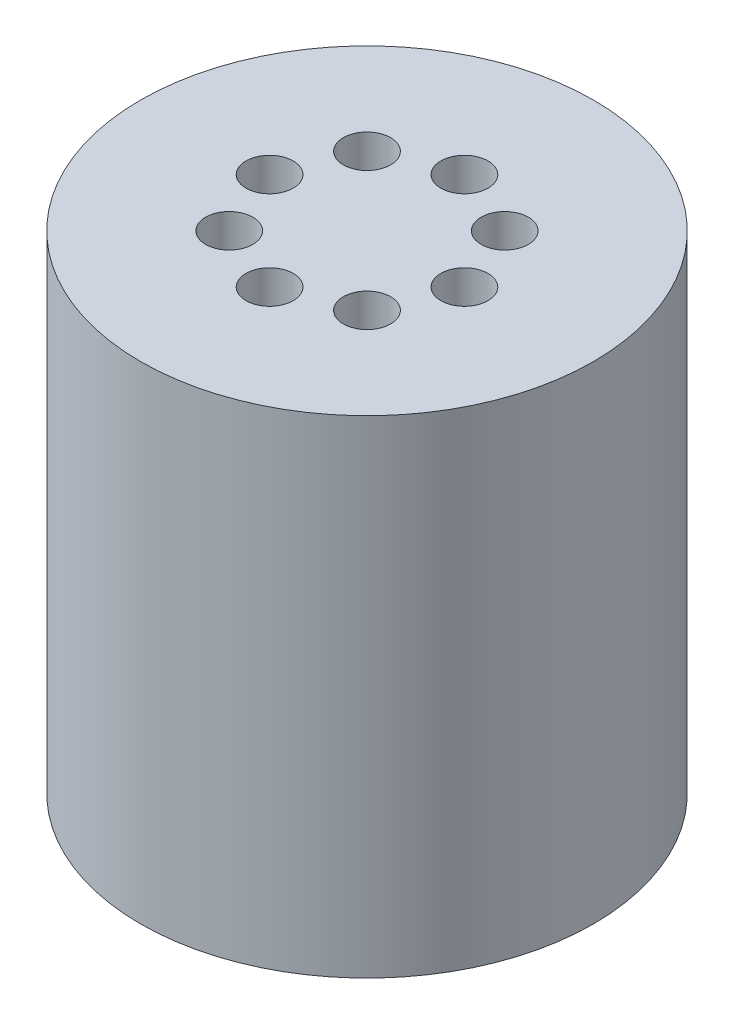
ISO-10303-21;
HEADER;
FILE_DESCRIPTION(('STEP AP214'),'2;1');
FILE_NAME('part.step','',(''),(''),'','','');
FILE_SCHEMA(('AUTOMOTIVE_DESIGN { 1 0 10303 214 1 1 1 1 }'));
ENDSEC;
DATA;
#1=APPLICATION_CONTEXT('core data for automotive mechanical design processes');
#2=APPLICATION_PROTOCOL_DEFINITION('international standard','automotive_design',2000,#1);
#3=PRODUCT_CONTEXT('',#1,'mechanical');
#4=PRODUCT('Part','Part','',(#3));
#5=PRODUCT_RELATED_PRODUCT_CATEGORY('part','',(#4));
#6=PRODUCT_DEFINITION_FORMATION('','',#4);
#7=PRODUCT_DEFINITION_CONTEXT('part definition',#1,'design');
#8=PRODUCT_DEFINITION('design','',#6,#7);
#9=PRODUCT_DEFINITION_SHAPE('','',#8);
#10=(LENGTH_UNIT() NAMED_UNIT(*) SI_UNIT(.MILLI.,.METRE.));
#11=(NAMED_UNIT(*) PLANE_ANGLE_UNIT() SI_UNIT($,.RADIAN.));
#12=(NAMED_UNIT(*) SI_UNIT($,.STERADIAN.) SOLID_ANGLE_UNIT());
#13=UNCERTAINTY_MEASURE_WITH_UNIT(LENGTH_MEASURE(1.E-05),#10,'distance_accuracy_value','');
#14=(GEOMETRIC_REPRESENTATION_CONTEXT(3) GLOBAL_UNCERTAINTY_ASSIGNED_CONTEXT((#13)) GLOBAL_UNIT_ASSIGNED_CONTEXT((#10,
#11,#12)) REPRESENTATION_CONTEXT('',''));
#15=CARTESIAN_POINT('',(0.,0.,0.));
#16=DIRECTION('',(0.,0.,1.));
#17=DIRECTION('',(1.,0.,0.));
#18=AXIS2_PLACEMENT_3D('',#15,#16,#17);
#19=CARTESIAN_POINT('',(0.,50.,0.));
#20=DIRECTION('',(0.,-1.,0.));
#21=DIRECTION('',(0.,0.,-1.));
#22=AXIS2_PLACEMENT_3D('',#19,#20,#21);
#23=CYLINDRICAL_SURFACE('',#22,23.25);
#24=CARTESIAN_POINT('',(0.,50.,0.));
#25=DIRECTION('',(0.,1.,0.));
#26=DIRECTION('',(0.,0.,1.));
#27=AXIS2_PLACEMENT_3D('',#24,#25,#26);
#28=CIRCLE('',#27,23.25);
#29=CARTESIAN_POINT('',(0.,50.,23.25));
#30=VERTEX_POINT('',#29);
#31=EDGE_CURVE('E10',#30,#30,#28,.T.);
#32=ORIENTED_EDGE('',*,*,#31,.F.);
#33=EDGE_LOOP('',(#32));
#34=FACE_BOUND('',#33,.T.);
#35=CARTESIAN_POINT('',(0.,0.,0.));
#36=DIRECTION('',(0.,1.,0.));
#37=DIRECTION('',(0.,0.,1.));
#38=AXIS2_PLACEMENT_3D('',#35,#36,#37);
#39=CIRCLE('',#38,23.25);
#40=CARTESIAN_POINT('',(0.,0.,23.25));
#41=VERTEX_POINT('',#40);
#42=EDGE_CURVE('E45',#41,#41,#39,.T.);
#43=ORIENTED_EDGE('',*,*,#42,.T.);
#44=EDGE_LOOP('',(#43));
#45=FACE_BOUND('',#44,.T.);
#46=ADVANCED_FACE('F42',(#34,#45),#23,.T.);
#47=CARTESIAN_POINT('',(0.,50.,0.));
#48=DIRECTION('',(0.,1.,0.));
#49=DIRECTION('',(0.,0.,1.));
#50=AXIS2_PLACEMENT_3D('',#47,#48,#49);
#51=PLANE('',#50);
#52=CARTESIAN_POINT('',(7.07106781186549,50.,-7.07106781186546));
#53=DIRECTION('',(0.,1.,0.));
#54=DIRECTION('',(0.,0.,1.));
#55=AXIS2_PLACEMENT_3D('',#52,#53,#54);
#56=CIRCLE('',#55,2.425);
#57=CARTESIAN_POINT('',(7.07106781186549,50.,-4.64606781186546));
#58=VERTEX_POINT('',#57);
#59=EDGE_CURVE('E68',#58,#58,#56,.T.);
#60=ORIENTED_EDGE('',*,*,#59,.F.);
#61=EDGE_LOOP('',(#60));
#62=FACE_BOUND('',#61,.T.);
#63=CARTESIAN_POINT('',(10.,50.,0.));
#64=DIRECTION('',(0.,1.,0.));
#65=DIRECTION('',(0.,0.,1.));
#66=AXIS2_PLACEMENT_3D('',#63,#64,#65);
#67=CIRCLE('',#66,2.425);
#68=CARTESIAN_POINT('',(10.,50.,2.42500000000003));
#69=VERTEX_POINT('',#68);
#70=EDGE_CURVE('E76',#69,#69,#67,.T.);
#71=ORIENTED_EDGE('',*,*,#70,.F.);
#72=EDGE_LOOP('',(#71));
#73=FACE_BOUND('',#72,.T.);
#74=CARTESIAN_POINT('',(7.07106781186544,50.,7.07106781186551));
#75=DIRECTION('',(0.,1.,0.));
#76=DIRECTION('',(0.,0.,1.));
#77=AXIS2_PLACEMENT_3D('',#74,#75,#76);
#78=CIRCLE('',#77,2.425);
#79=CARTESIAN_POINT('',(7.07106781186544,50.,9.49606781186551));
#80=VERTEX_POINT('',#79);
#81=EDGE_CURVE('E84',#80,#80,#78,.T.);
#82=ORIENTED_EDGE('',*,*,#81,.F.);
#83=EDGE_LOOP('',(#82));
#84=FACE_BOUND('',#83,.T.);
#85=CARTESIAN_POINT('',(-7.07106781186539,50.,-7.07106781186556));
#86=DIRECTION('',(0.,1.,0.));
#87=DIRECTION('',(0.,0.,1.));
#88=AXIS2_PLACEMENT_3D('',#85,#86,#87);
#89=CIRCLE('',#88,2.425);
#90=CARTESIAN_POINT('',(-7.07106781186539,50.,-4.64606781186556));
#91=VERTEX_POINT('',#90);
#92=EDGE_CURVE('E60',#91,#91,#89,.T.);
#93=ORIENTED_EDGE('',*,*,#92,.F.);
#94=EDGE_LOOP('',(#93));
#95=FACE_BOUND('',#94,.T.);
#96=CARTESIAN_POINT('',(-7.07106781186554,50.,7.07106781186541));
#97=DIRECTION('',(0.,1.,0.));
#98=DIRECTION('',(0.,0.,1.));
#99=AXIS2_PLACEMENT_3D('',#96,#97,#98);
#100=CIRCLE('',#99,2.425);
#101=CARTESIAN_POINT('',(-7.07106781186554,50.,9.49606781186541));
#102=VERTEX_POINT('',#101);
#103=EDGE_CURVE('E93',#102,#102,#100,.T.);
#104=ORIENTED_EDGE('',*,*,#103,.F.);
#105=EDGE_LOOP('',(#104));
#106=FACE_BOUND('',#105,.T.);
#107=CARTESIAN_POINT('',(-10.,50.,-1.04744440165294E-13));
#108=DIRECTION('',(0.,1.,0.));
#109=DIRECTION('',(0.,0.,1.));
#110=AXIS2_PLACEMENT_3D('',#107,#108,#109);
#111=CIRCLE('',#110,2.425);
#112=CARTESIAN_POINT('',(-10.,50.,2.42499999999989));
#113=VERTEX_POINT('',#112);
#114=EDGE_CURVE('E94',#113,#113,#111,.T.);
#115=ORIENTED_EDGE('',*,*,#114,.F.);
#116=EDGE_LOOP('',(#115));
#117=FACE_BOUND('',#116,.T.);
#118=CARTESIAN_POINT('',(0.,50.,10.));
#119=DIRECTION('',(0.,1.,0.));
#120=DIRECTION('',(0.,0.,1.));
#121=AXIS2_PLACEMENT_3D('',#118,#119,#120);
#122=CIRCLE('',#121,2.425);
#123=CARTESIAN_POINT('',(0.,50.,12.425));
#124=VERTEX_POINT('',#123);
#125=EDGE_CURVE('E108',#124,#124,#122,.T.);
#126=ORIENTED_EDGE('',*,*,#125,.F.);
#127=EDGE_LOOP('',(#126));
#128=FACE_BOUND('',#127,.T.);
#129=CARTESIAN_POINT('',(0.,50.,-10.));
#130=DIRECTION('',(0.,1.,0.));
#131=DIRECTION('',(0.,0.,1.));
#132=AXIS2_PLACEMENT_3D('',#129,#130,#131);
#133=CIRCLE('',#132,2.425);
#134=CARTESIAN_POINT('',(0.,50.,-7.575));
#135=VERTEX_POINT('',#134);
#136=EDGE_CURVE('E56',#135,#135,#133,.T.);
#137=ORIENTED_EDGE('',*,*,#136,.F.);
#138=EDGE_LOOP('',(#137));
#139=FACE_BOUND('',#138,.T.);
#140=ORIENTED_EDGE('',*,*,#31,.T.);
#141=EDGE_LOOP('',(#140));
#142=FACE_BOUND('',#141,.T.);
#143=ADVANCED_FACE('F122',(#62,#73,#84,#95,#106,#117,#128,#139,#142),#51,.T.);
#144=CARTESIAN_POINT('',(0.,0.,0.));
#145=DIRECTION('',(0.,1.,0.));
#146=DIRECTION('',(0.,0.,1.));
#147=AXIS2_PLACEMENT_3D('',#144,#145,#146);
#148=PLANE('',#147);
#149=ORIENTED_EDGE('',*,*,#42,.F.);
#150=EDGE_LOOP('',(#149));
#151=FACE_BOUND('',#150,.T.);
#152=ADVANCED_FACE('F125',(#151),#148,.F.);
#153=CARTESIAN_POINT('',(0.,45.,-10.));
#154=DIRECTION('',(0.,1.,0.));
#155=DIRECTION('',(0.,0.,1.));
#156=AXIS2_PLACEMENT_3D('',#153,#154,#155);
#157=CYLINDRICAL_SURFACE('',#156,2.425);
#158=CARTESIAN_POINT('',(0.,45.,-10.));
#159=DIRECTION('',(0.,1.,0.));
#160=DIRECTION('',(0.,0.,1.));
#161=AXIS2_PLACEMENT_3D('',#158,#159,#160);
#162=CIRCLE('',#161,2.425);
#163=CARTESIAN_POINT('',(0.,45.,-7.575));
#164=VERTEX_POINT('',#163);
#165=EDGE_CURVE('E54',#164,#164,#162,.T.);
#166=ORIENTED_EDGE('',*,*,#165,.F.);
#167=EDGE_LOOP('',(#166));
#168=FACE_BOUND('',#167,.T.);
#169=ORIENTED_EDGE('',*,*,#136,.T.);
#170=EDGE_LOOP('',(#169));
#171=FACE_BOUND('',#170,.T.);
#172=ADVANCED_FACE('F132',(#168,#171),#157,.F.);
#173=CARTESIAN_POINT('',(0.,45.,-10.));
#174=DIRECTION('',(0.,1.,0.));
#175=DIRECTION('',(0.,0.,1.));
#176=AXIS2_PLACEMENT_3D('',#173,#174,#175);
#177=PLANE('',#176);
#178=ORIENTED_EDGE('',*,*,#165,.T.);
#179=EDGE_LOOP('',(#178));
#180=FACE_BOUND('',#179,.T.);
#181=ADVANCED_FACE('F134',(#180),#177,.T.);
#182=CARTESIAN_POINT('',(0.,45.,10.));
#183=DIRECTION('',(0.,1.,0.));
#184=DIRECTION('',(0.,0.,1.));
#185=AXIS2_PLACEMENT_3D('',#182,#183,#184);
#186=CYLINDRICAL_SURFACE('',#185,2.425);
#187=CARTESIAN_POINT('',(0.,45.,10.));
#188=DIRECTION('',(0.,1.,0.));
#189=DIRECTION('',(0.,0.,1.));
#190=AXIS2_PLACEMENT_3D('',#187,#188,#189);
#191=CIRCLE('',#190,2.425);
#192=CARTESIAN_POINT('',(0.,45.,12.425));
#193=VERTEX_POINT('',#192);
#194=EDGE_CURVE('E88',#193,#193,#191,.T.);
#195=ORIENTED_EDGE('',*,*,#194,.F.);
#196=EDGE_LOOP('',(#195));
#197=FACE_BOUND('',#196,.T.);
#198=ORIENTED_EDGE('',*,*,#125,.T.);
#199=EDGE_LOOP('',(#198));
#200=FACE_BOUND('',#199,.T.);
#201=ADVANCED_FACE('F140',(#197,#200),#186,.F.);
#202=CARTESIAN_POINT('',(0.,45.,10.));
#203=DIRECTION('',(0.,1.,0.));
#204=DIRECTION('',(0.,0.,1.));
#205=AXIS2_PLACEMENT_3D('',#202,#203,#204);
#206=PLANE('',#205);
#207=ORIENTED_EDGE('',*,*,#194,.T.);
#208=EDGE_LOOP('',(#207));
#209=FACE_BOUND('',#208,.T.);
#210=ADVANCED_FACE('F182',(#209),#206,.T.);
#211=CARTESIAN_POINT('',(-10.,45.,-1.04744440165294E-13));
#212=DIRECTION('',(0.,1.,0.));
#213=DIRECTION('',(0.,0.,1.));
#214=AXIS2_PLACEMENT_3D('',#211,#212,#213);
#215=CYLINDRICAL_SURFACE('',#214,2.425);
#216=CARTESIAN_POINT('',(-10.,45.,-1.04744440165294E-13));
#217=DIRECTION('',(0.,1.,0.));
#218=DIRECTION('',(0.,0.,1.));
#219=AXIS2_PLACEMENT_3D('',#216,#217,#218);
#220=CIRCLE('',#219,2.425);
#221=CARTESIAN_POINT('',(-10.,45.,2.42499999999989));
#222=VERTEX_POINT('',#221);
#223=EDGE_CURVE('E112',#222,#222,#220,.T.);
#224=ORIENTED_EDGE('',*,*,#223,.F.);
#225=EDGE_LOOP('',(#224));
#226=FACE_BOUND('',#225,.T.);
#227=ORIENTED_EDGE('',*,*,#114,.T.);
#228=EDGE_LOOP('',(#227));
#229=FACE_BOUND('',#228,.T.);
#230=ADVANCED_FACE('F120',(#226,#229),#215,.F.);
#231=CARTESIAN_POINT('',(-10.,45.,-1.04744440165294E-13));
#232=DIRECTION('',(0.,1.,0.));
#233=DIRECTION('',(0.,0.,1.));
#234=AXIS2_PLACEMENT_3D('',#231,#232,#233);
#235=PLANE('',#234);
#236=ORIENTED_EDGE('',*,*,#223,.T.);
#237=EDGE_LOOP('',(#236));
#238=FACE_BOUND('',#237,.T.);
#239=ADVANCED_FACE('F199',(#238),#235,.T.);
#240=CARTESIAN_POINT('',(-7.07106781186554,45.,7.07106781186541));
#241=DIRECTION('',(0.,1.,0.));
#242=DIRECTION('',(0.,0.,1.));
#243=AXIS2_PLACEMENT_3D('',#240,#241,#242);
#244=CYLINDRICAL_SURFACE('',#243,2.425);
#245=CARTESIAN_POINT('',(-7.07106781186554,45.,7.07106781186541));
#246=DIRECTION('',(0.,1.,0.));
#247=DIRECTION('',(0.,0.,1.));
#248=AXIS2_PLACEMENT_3D('',#245,#246,#247);
#249=CIRCLE('',#248,2.425);
#250=CARTESIAN_POINT('',(-7.07106781186554,45.,9.49606781186541));
#251=VERTEX_POINT('',#250);
#252=EDGE_CURVE('E89',#251,#251,#249,.T.);
#253=ORIENTED_EDGE('',*,*,#252,.F.);
#254=EDGE_LOOP('',(#253));
#255=FACE_BOUND('',#254,.T.);
#256=ORIENTED_EDGE('',*,*,#103,.T.);
#257=EDGE_LOOP('',(#256));
#258=FACE_BOUND('',#257,.T.);
#259=ADVANCED_FACE('F208',(#255,#258),#244,.F.);
#260=CARTESIAN_POINT('',(-7.07106781186554,45.,7.07106781186541));
#261=DIRECTION('',(0.,1.,0.));
#262=DIRECTION('',(0.,0.,1.));
#263=AXIS2_PLACEMENT_3D('',#260,#261,#262);
#264=PLANE('',#263);
#265=ORIENTED_EDGE('',*,*,#252,.T.);
#266=EDGE_LOOP('',(#265));
#267=FACE_BOUND('',#266,.T.);
#268=ADVANCED_FACE('F217',(#267),#264,.T.);
#269=CARTESIAN_POINT('',(-7.07106781186539,45.,-7.07106781186556));
#270=DIRECTION('',(0.,1.,0.));
#271=DIRECTION('',(0.,0.,1.));
#272=AXIS2_PLACEMENT_3D('',#269,#270,#271);
#273=CYLINDRICAL_SURFACE('',#272,2.425);
#274=CARTESIAN_POINT('',(-7.07106781186539,45.,-7.07106781186556));
#275=DIRECTION('',(0.,1.,0.));
#276=DIRECTION('',(0.,0.,1.));
#277=AXIS2_PLACEMENT_3D('',#274,#275,#276);
#278=CIRCLE('',#277,2.425);
#279=CARTESIAN_POINT('',(-7.07106781186539,45.,-4.64606781186556));
#280=VERTEX_POINT('',#279);
#281=EDGE_CURVE('E98',#280,#280,#278,.T.);
#282=ORIENTED_EDGE('',*,*,#281,.F.);
#283=EDGE_LOOP('',(#282));
#284=FACE_BOUND('',#283,.T.);
#285=ORIENTED_EDGE('',*,*,#92,.T.);
#286=EDGE_LOOP('',(#285));
#287=FACE_BOUND('',#286,.T.);
#288=ADVANCED_FACE('F226',(#284,#287),#273,.F.);
#289=CARTESIAN_POINT('',(-7.07106781186539,45.,-7.07106781186556));
#290=DIRECTION('',(0.,1.,0.));
#291=DIRECTION('',(0.,0.,1.));
#292=AXIS2_PLACEMENT_3D('',#289,#290,#291);
#293=PLANE('',#292);
#294=ORIENTED_EDGE('',*,*,#281,.T.);
#295=EDGE_LOOP('',(#294));
#296=FACE_BOUND('',#295,.T.);
#297=ADVANCED_FACE('F235',(#296),#293,.T.);
#298=CARTESIAN_POINT('',(7.07106781186544,45.,7.07106781186551));
#299=DIRECTION('',(0.,1.,0.));
#300=DIRECTION('',(0.,0.,1.));
#301=AXIS2_PLACEMENT_3D('',#298,#299,#300);
#302=CYLINDRICAL_SURFACE('',#301,2.425);
#303=CARTESIAN_POINT('',(7.07106781186544,45.,7.07106781186551));
#304=DIRECTION('',(0.,1.,0.));
#305=DIRECTION('',(0.,0.,1.));
#306=AXIS2_PLACEMENT_3D('',#303,#304,#305);
#307=CIRCLE('',#306,2.425);
#308=CARTESIAN_POINT('',(7.07106781186544,45.,9.49606781186551));
#309=VERTEX_POINT('',#308);
#310=EDGE_CURVE('E80',#309,#309,#307,.T.);
#311=ORIENTED_EDGE('',*,*,#310,.F.);
#312=EDGE_LOOP('',(#311));
#313=FACE_BOUND('',#312,.T.);
#314=ORIENTED_EDGE('',*,*,#81,.T.);
#315=EDGE_LOOP('',(#314));
#316=FACE_BOUND('',#315,.T.);
#317=ADVANCED_FACE('F244',(#313,#316),#302,.F.);
#318=CARTESIAN_POINT('',(7.07106781186544,45.,7.07106781186551));
#319=DIRECTION('',(0.,1.,0.));
#320=DIRECTION('',(0.,0.,1.));
#321=AXIS2_PLACEMENT_3D('',#318,#319,#320);
#322=PLANE('',#321);
#323=ORIENTED_EDGE('',*,*,#310,.T.);
#324=EDGE_LOOP('',(#323));
#325=FACE_BOUND('',#324,.T.);
#326=ADVANCED_FACE('F253',(#325),#322,.T.);
#327=CARTESIAN_POINT('',(10.,45.,0.));
#328=DIRECTION('',(0.,1.,0.));
#329=DIRECTION('',(0.,0.,1.));
#330=AXIS2_PLACEMENT_3D('',#327,#328,#329);
#331=CYLINDRICAL_SURFACE('',#330,2.425);
#332=CARTESIAN_POINT('',(10.,45.,0.));
#333=DIRECTION('',(0.,1.,0.));
#334=DIRECTION('',(0.,0.,1.));
#335=AXIS2_PLACEMENT_3D('',#332,#333,#334);
#336=CIRCLE('',#335,2.425);
#337=CARTESIAN_POINT('',(10.,45.,2.42500000000003));
#338=VERTEX_POINT('',#337);
#339=EDGE_CURVE('E72',#338,#338,#336,.T.);
#340=ORIENTED_EDGE('',*,*,#339,.F.);
#341=EDGE_LOOP('',(#340));
#342=FACE_BOUND('',#341,.T.);
#343=ORIENTED_EDGE('',*,*,#70,.T.);
#344=EDGE_LOOP('',(#343));
#345=FACE_BOUND('',#344,.T.);
#346=ADVANCED_FACE('F262',(#342,#345),#331,.F.);
#347=CARTESIAN_POINT('',(10.,45.,0.));
#348=DIRECTION('',(0.,1.,0.));
#349=DIRECTION('',(0.,0.,1.));
#350=AXIS2_PLACEMENT_3D('',#347,#348,#349);
#351=PLANE('',#350);
#352=ORIENTED_EDGE('',*,*,#339,.T.);
#353=EDGE_LOOP('',(#352));
#354=FACE_BOUND('',#353,.T.);
#355=ADVANCED_FACE('F271',(#354),#351,.T.);
#356=CARTESIAN_POINT('',(7.07106781186549,45.,-7.07106781186546));
#357=DIRECTION('',(0.,1.,0.));
#358=DIRECTION('',(0.,0.,1.));
#359=AXIS2_PLACEMENT_3D('',#356,#357,#358);
#360=CYLINDRICAL_SURFACE('',#359,2.425);
#361=CARTESIAN_POINT('',(7.07106781186549,45.,-7.07106781186546));
#362=DIRECTION('',(0.,1.,0.));
#363=DIRECTION('',(0.,0.,1.));
#364=AXIS2_PLACEMENT_3D('',#361,#362,#363);
#365=CIRCLE('',#364,2.425);
#366=CARTESIAN_POINT('',(7.07106781186549,45.,-4.64606781186546));
#367=VERTEX_POINT('',#366);
#368=EDGE_CURVE('E64',#367,#367,#365,.T.);
#369=ORIENTED_EDGE('',*,*,#368,.F.);
#370=EDGE_LOOP('',(#369));
#371=FACE_BOUND('',#370,.T.);
#372=ORIENTED_EDGE('',*,*,#59,.T.);
#373=EDGE_LOOP('',(#372));
#374=FACE_BOUND('',#373,.T.);
#375=ADVANCED_FACE('F280',(#371,#374),#360,.F.);
#376=CARTESIAN_POINT('',(7.07106781186549,45.,-7.07106781186546));
#377=DIRECTION('',(0.,1.,0.));
#378=DIRECTION('',(0.,0.,1.));
#379=AXIS2_PLACEMENT_3D('',#376,#377,#378);
#380=PLANE('',#379);
#381=ORIENTED_EDGE('',*,*,#368,.T.);
#382=EDGE_LOOP('',(#381));
#383=FACE_BOUND('',#382,.T.);
#384=ADVANCED_FACE('F289',(#383),#380,.T.);
#385=CLOSED_SHELL('',(#46,#143,#152,#172,#181,#201,#210,#230,#239,#259,#268,#288,#297,#317,#326,
#346,#355,#375,#384));
#386=MANIFOLD_SOLID_BREP('B2',#385);
#387=ADVANCED_BREP_SHAPE_REPRESENTATION('',(#18,#386),#14);
#388=SHAPE_DEFINITION_REPRESENTATION(#9,#387);
ENDSEC;
END-ISO-10303-21;
